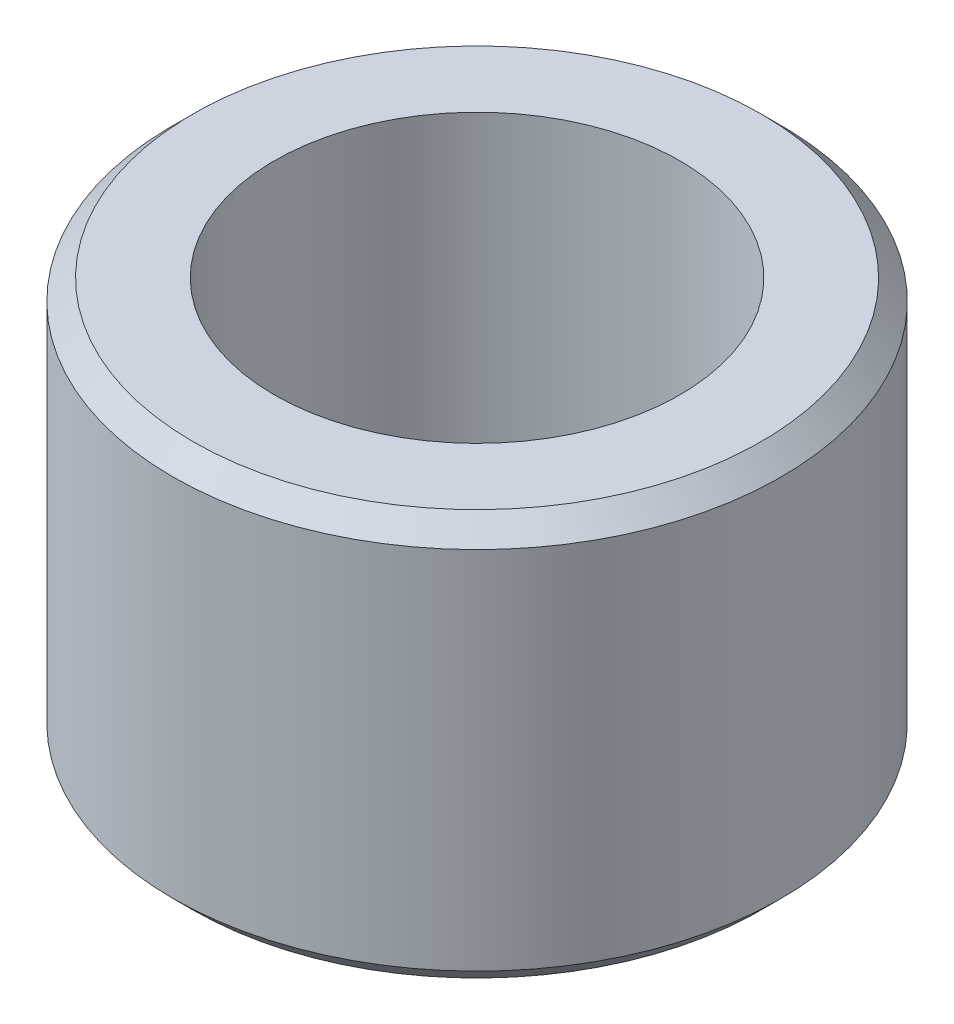
ISO-10303-21;
HEADER;
FILE_DESCRIPTION(('STEP AP214'),'2;1');
FILE_NAME('part.step','',(''),(''),'','','');
FILE_SCHEMA(('AUTOMOTIVE_DESIGN { 1 0 10303 214 1 1 1 1 }'));
ENDSEC;
DATA;
#1=APPLICATION_CONTEXT('core data for automotive mechanical design processes');
#2=APPLICATION_PROTOCOL_DEFINITION('international standard','automotive_design',2000,#1);
#3=PRODUCT_CONTEXT('',#1,'mechanical');
#4=PRODUCT('Part','Part','',(#3));
#5=PRODUCT_RELATED_PRODUCT_CATEGORY('part','',(#4));
#6=PRODUCT_DEFINITION_FORMATION('','',#4);
#7=PRODUCT_DEFINITION_CONTEXT('part definition',#1,'design');
#8=PRODUCT_DEFINITION('design','',#6,#7);
#9=PRODUCT_DEFINITION_SHAPE('','',#8);
#10=(LENGTH_UNIT() NAMED_UNIT(*) SI_UNIT(.MILLI.,.METRE.));
#11=(NAMED_UNIT(*) PLANE_ANGLE_UNIT() SI_UNIT($,.RADIAN.));
#12=(NAMED_UNIT(*) SI_UNIT($,.STERADIAN.) SOLID_ANGLE_UNIT());
#13=UNCERTAINTY_MEASURE_WITH_UNIT(LENGTH_MEASURE(1.E-05),#10,'distance_accuracy_value','');
#14=(GEOMETRIC_REPRESENTATION_CONTEXT(3) GLOBAL_UNCERTAINTY_ASSIGNED_CONTEXT((#13)) GLOBAL_UNIT_ASSIGNED_CONTEXT((#10,
#11,#12)) REPRESENTATION_CONTEXT('',''));
#15=CARTESIAN_POINT('',(0.,0.,0.));
#16=DIRECTION('',(0.,0.,1.));
#17=DIRECTION('',(1.,0.,0.));
#18=AXIS2_PLACEMENT_3D('',#15,#16,#17);
#19=CARTESIAN_POINT('',(0.,20.,0.));
#20=DIRECTION('',(0.,1.,0.));
#21=DIRECTION('',(0.,0.,1.));
#22=AXIS2_PLACEMENT_3D('',#19,#20,#21);
#23=PLANE('',#22);
#24=CARTESIAN_POINT('',(0.,20.,0.));
#25=DIRECTION('',(0.,1.,0.));
#26=DIRECTION('',(0.,0.,1.));
#27=AXIS2_PLACEMENT_3D('',#24,#25,#26);
#28=CIRCLE('',#27,14.);
#29=CARTESIAN_POINT('',(0.,20.,14.));
#30=VERTEX_POINT('',#29);
#31=EDGE_CURVE('E10',#30,#30,#28,.T.);
#32=ORIENTED_EDGE('',*,*,#31,.T.);
#33=EDGE_LOOP('',(#32));
#34=FACE_BOUND('',#33,.T.);
#35=CARTESIAN_POINT('',(0.,20.,0.));
#36=DIRECTION('',(0.,1.,0.));
#37=DIRECTION('',(0.,0.,1.));
#38=AXIS2_PLACEMENT_3D('',#35,#36,#37);
#39=CIRCLE('',#38,10.);
#40=CARTESIAN_POINT('',(0.,20.,10.));
#41=VERTEX_POINT('',#40);
#42=EDGE_CURVE('E60',#41,#41,#39,.T.);
#43=ORIENTED_EDGE('',*,*,#42,.F.);
#44=EDGE_LOOP('',(#43));
#45=FACE_BOUND('',#44,.T.);
#46=ADVANCED_FACE('F39',(#34,#45),#23,.T.);
#47=CARTESIAN_POINT('',(0.,0.,0.));
#48=DIRECTION('',(0.,1.,0.));
#49=DIRECTION('',(0.,0.,1.));
#50=AXIS2_PLACEMENT_3D('',#47,#48,#49);
#51=PLANE('',#50);
#52=CARTESIAN_POINT('',(0.,0.,0.));
#53=DIRECTION('',(0.,1.,0.));
#54=DIRECTION('',(0.,0.,1.));
#55=AXIS2_PLACEMENT_3D('',#52,#53,#54);
#56=CIRCLE('',#55,14.);
#57=CARTESIAN_POINT('',(0.,0.,14.));
#58=VERTEX_POINT('',#57);
#59=EDGE_CURVE('E47',#58,#58,#56,.F.);
#60=ORIENTED_EDGE('',*,*,#59,.T.);
#61=EDGE_LOOP('',(#60));
#62=FACE_BOUND('',#61,.T.);
#63=CARTESIAN_POINT('',(0.,0.,0.));
#64=DIRECTION('',(0.,1.,0.));
#65=DIRECTION('',(0.,0.,1.));
#66=AXIS2_PLACEMENT_3D('',#63,#64,#65);
#67=CIRCLE('',#66,10.);
#68=CARTESIAN_POINT('',(0.,0.,10.));
#69=VERTEX_POINT('',#68);
#70=EDGE_CURVE('E61',#69,#69,#67,.T.);
#71=ORIENTED_EDGE('',*,*,#70,.T.);
#72=EDGE_LOOP('',(#71));
#73=FACE_BOUND('',#72,.T.);
#74=ADVANCED_FACE('F71',(#62,#73),#51,.F.);
#75=CARTESIAN_POINT('',(0.,20.,0.));
#76=DIRECTION('',(0.,-1.,0.));
#77=DIRECTION('',(0.,0.,-1.));
#78=AXIS2_PLACEMENT_3D('',#75,#76,#77);
#79=CYLINDRICAL_SURFACE('',#78,15.);
#80=CARTESIAN_POINT('',(0.,0.999999999999997,0.));
#81=DIRECTION('',(0.,1.,0.));
#82=DIRECTION('',(0.,0.,1.));
#83=AXIS2_PLACEMENT_3D('',#80,#81,#82);
#84=CIRCLE('',#83,15.);
#85=CARTESIAN_POINT('',(0.,0.999999999999997,15.));
#86=VERTEX_POINT('',#85);
#87=EDGE_CURVE('E51',#86,#86,#84,.T.);
#88=ORIENTED_EDGE('',*,*,#87,.T.);
#89=EDGE_LOOP('',(#88));
#90=FACE_BOUND('',#89,.T.);
#91=CARTESIAN_POINT('',(0.,19.,0.));
#92=DIRECTION('',(0.,1.,0.));
#93=DIRECTION('',(0.,0.,1.));
#94=AXIS2_PLACEMENT_3D('',#91,#92,#93);
#95=CIRCLE('',#94,15.);
#96=CARTESIAN_POINT('',(0.,19.,15.));
#97=VERTEX_POINT('',#96);
#98=EDGE_CURVE('E55',#97,#97,#95,.F.);
#99=ORIENTED_EDGE('',*,*,#98,.T.);
#100=EDGE_LOOP('',(#99));
#101=FACE_BOUND('',#100,.T.);
#102=ADVANCED_FACE('F77',(#90,#101),#79,.T.);
#103=CARTESIAN_POINT('',(0.,20.,0.));
#104=DIRECTION('',(0.,-1.,0.));
#105=DIRECTION('',(0.,0.,-1.));
#106=AXIS2_PLACEMENT_3D('',#103,#104,#105);
#107=CYLINDRICAL_SURFACE('',#106,10.);
#108=ORIENTED_EDGE('',*,*,#42,.T.);
#109=EDGE_LOOP('',(#108));
#110=FACE_BOUND('',#109,.T.);
#111=ORIENTED_EDGE('',*,*,#70,.F.);
#112=EDGE_LOOP('',(#111));
#113=FACE_BOUND('',#112,.T.);
#114=ADVANCED_FACE('F67',(#110,#113),#107,.F.);
#115=CARTESIAN_POINT('',(0.,0.999999999999997,0.));
#116=DIRECTION('',(0.,1.,0.));
#117=DIRECTION('',(0.,0.,1.));
#118=AXIS2_PLACEMENT_3D('',#115,#116,#117);
#119=CONICAL_SURFACE('',#118,15.,0.785398163397453);
#120=ORIENTED_EDGE('',*,*,#59,.F.);
#121=EDGE_LOOP('',(#120));
#122=FACE_BOUND('',#121,.T.);
#123=ORIENTED_EDGE('',*,*,#87,.F.);
#124=EDGE_LOOP('',(#123));
#125=FACE_BOUND('',#124,.T.);
#126=ADVANCED_FACE('F84',(#122,#125),#119,.T.);
#127=CARTESIAN_POINT('',(0.,20.,0.));
#128=DIRECTION('',(0.,-1.,0.));
#129=DIRECTION('',(0.,0.,-1.));
#130=AXIS2_PLACEMENT_3D('',#127,#128,#129);
#131=CONICAL_SURFACE('',#130,14.,0.785398163397446);
#132=ORIENTED_EDGE('',*,*,#98,.F.);
#133=EDGE_LOOP('',(#132));
#134=FACE_BOUND('',#133,.T.);
#135=ORIENTED_EDGE('',*,*,#31,.F.);
#136=EDGE_LOOP('',(#135));
#137=FACE_BOUND('',#136,.T.);
#138=ADVANCED_FACE('F42',(#134,#137),#131,.T.);
#139=CLOSED_SHELL('',(#46,#74,#102,#114,#126,#138));
#140=MANIFOLD_SOLID_BREP('B2',#139);
#141=ADVANCED_BREP_SHAPE_REPRESENTATION('',(#18,#140),#14);
#142=SHAPE_DEFINITION_REPRESENTATION(#9,#141);
ENDSEC;
END-ISO-10303-21;
